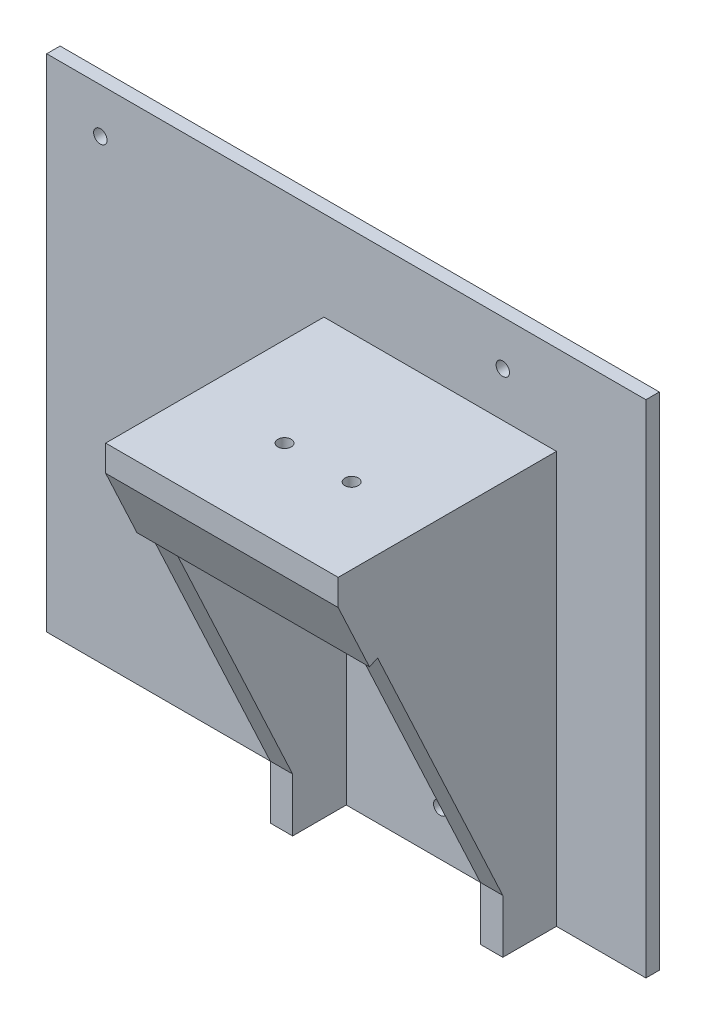
ISO-10303-21;
HEADER;
FILE_DESCRIPTION(('STEP AP214'),'2;1');
FILE_NAME('part.step','',(''),(''),'','','');
FILE_SCHEMA(('AUTOMOTIVE_DESIGN { 1 0 10303 214 1 1 1 1 }'));
ENDSEC;
DATA;
#1=APPLICATION_CONTEXT('core data for automotive mechanical design processes');
#2=APPLICATION_PROTOCOL_DEFINITION('international standard','automotive_design',2000,#1);
#3=PRODUCT_CONTEXT('',#1,'mechanical');
#4=PRODUCT('Part','Part','',(#3));
#5=PRODUCT_RELATED_PRODUCT_CATEGORY('part','',(#4));
#6=PRODUCT_DEFINITION_FORMATION('','',#4);
#7=PRODUCT_DEFINITION_CONTEXT('part definition',#1,'design');
#8=PRODUCT_DEFINITION('design','',#6,#7);
#9=PRODUCT_DEFINITION_SHAPE('','',#8);
#10=(LENGTH_UNIT() NAMED_UNIT(*) SI_UNIT(.MILLI.,.METRE.));
#11=(NAMED_UNIT(*) PLANE_ANGLE_UNIT() SI_UNIT($,.RADIAN.));
#12=(NAMED_UNIT(*) SI_UNIT($,.STERADIAN.) SOLID_ANGLE_UNIT());
#13=UNCERTAINTY_MEASURE_WITH_UNIT(LENGTH_MEASURE(1.E-05),#10,'distance_accuracy_value','');
#14=(GEOMETRIC_REPRESENTATION_CONTEXT(3) GLOBAL_UNCERTAINTY_ASSIGNED_CONTEXT((#13)) GLOBAL_UNIT_ASSIGNED_CONTEXT((#10,
#11,#12)) REPRESENTATION_CONTEXT('',''));
#15=CARTESIAN_POINT('',(0.,0.,0.));
#16=DIRECTION('',(0.,0.,1.));
#17=DIRECTION('',(1.,0.,0.));
#18=AXIS2_PLACEMENT_3D('',#15,#16,#17);
#19=CARTESIAN_POINT('',(36.,-46.,3.));
#20=DIRECTION('',(-1.,0.,0.));
#21=DIRECTION('',(0.,-1.,0.));
#22=AXIS2_PLACEMENT_3D('',#19,#20,#21);
#23=PLANE('',#22);
#24=DIRECTION('',(0.,-1.,0.));
#25=VECTOR('',#24,1.);
#26=CARTESIAN_POINT('',(36.,-46.,3.));
#27=LINE('',#26,#25);
#28=CARTESIAN_POINT('',(36.,46.,3.));
#29=VERTEX_POINT('',#28);
#30=CARTESIAN_POINT('',(36.,-46.,3.));
#31=VERTEX_POINT('',#30);
#32=EDGE_CURVE('E11',#29,#31,#27,.T.);
#33=ORIENTED_EDGE('',*,*,#32,.F.);
#34=DIRECTION('',(0.,0.,-1.));
#35=VECTOR('',#34,1.);
#36=CARTESIAN_POINT('',(36.,46.,3.));
#37=LINE('',#36,#35);
#38=CARTESIAN_POINT('',(36.,46.,51.8123662799905));
#39=VERTEX_POINT('',#38);
#40=EDGE_CURVE('E319',#39,#29,#37,.T.);
#41=ORIENTED_EDGE('',*,*,#40,.F.);
#42=DIRECTION('',(0.,1.,0.));
#43=VECTOR('',#42,1.);
#44=CARTESIAN_POINT('',(36.,0.,51.8123662799905));
#45=LINE('',#44,#43);
#46=CARTESIAN_POINT('',(36.,40.1542290693378,51.8123662799905));
#47=VERTEX_POINT('',#46);
#48=EDGE_CURVE('E243',#47,#39,#45,.T.);
#49=ORIENTED_EDGE('',*,*,#48,.F.);
#50=DIRECTION('',(0.,0.906183139995265,0.422885465331124));
#51=VECTOR('',#50,1.);
#52=CARTESIAN_POINT('',(36.,40.1542290693378,51.8123662799905));
#53=LINE('',#52,#51);
#54=CARTESIAN_POINT('',(36.,25.1542290693377,44.8123662799905));
#55=VERTEX_POINT('',#54);
#56=EDGE_CURVE('E254',#55,#47,#53,.T.);
#57=ORIENTED_EDGE('',*,*,#56,.F.);
#58=DIRECTION('',(0.,0.422885465331124,-0.906183139995265));
#59=VECTOR('',#58,1.);
#60=CARTESIAN_POINT('',(36.,25.1542290693377,44.8123662799905));
#61=LINE('',#60,#59);
#62=CARTESIAN_POINT('',(36.,26.,43.));
#63=VERTEX_POINT('',#62);
#64=EDGE_CURVE('E260',#55,#63,#61,.T.);
#65=ORIENTED_EDGE('',*,*,#64,.T.);
#66=DIRECTION('',(0.,0.906183139995265,0.422885465331124));
#67=VECTOR('',#66,1.);
#68=CARTESIAN_POINT('',(36.,-11.8284671532847,25.3467153284672));
#69=LINE('',#68,#67);
#70=CARTESIAN_POINT('',(36.,-34.,15.));
#71=VERTEX_POINT('',#70);
#72=EDGE_CURVE('E59',#71,#63,#69,.T.);
#73=ORIENTED_EDGE('',*,*,#72,.F.);
#74=DIRECTION('',(0.,1.,0.));
#75=VECTOR('',#74,1.);
#76=CARTESIAN_POINT('',(36.,0.,15.));
#77=LINE('',#76,#75);
#78=CARTESIAN_POINT('',(36.,-46.,15.));
#79=VERTEX_POINT('',#78);
#80=EDGE_CURVE('E293',#79,#71,#77,.T.);
#81=ORIENTED_EDGE('',*,*,#80,.F.);
#82=DIRECTION('',(0.,0.,-1.));
#83=VECTOR('',#82,1.);
#84=CARTESIAN_POINT('',(36.,-46.,3.));
#85=LINE('',#84,#83);
#86=EDGE_CURVE('E316',#79,#31,#85,.T.);
#87=ORIENTED_EDGE('',*,*,#86,.T.);
#88=EDGE_LOOP('',(#33,#41,#49,#57,#65,#73,#81,#87));
#89=FACE_BOUND('',#88,.T.);
#90=ADVANCED_FACE('F35',(#89),#23,.F.);
#91=CARTESIAN_POINT('',(-36.,46.,3.));
#92=DIRECTION('',(0.,-1.,0.));
#93=DIRECTION('',(0.,0.,-1.));
#94=AXIS2_PLACEMENT_3D('',#91,#92,#93);
#95=PLANE('',#94);
#96=CARTESIAN_POINT('',(19.,46.,31.8123662799905));
#97=DIRECTION('',(0.,1.,0.));
#98=DIRECTION('',(0.,0.,1.));
#99=AXIS2_PLACEMENT_3D('',#96,#97,#98);
#100=CIRCLE('',#99,1.5);
#101=CARTESIAN_POINT('',(19.,46.,33.3123662799905));
#102=VERTEX_POINT('',#101);
#103=EDGE_CURVE('E221',#102,#102,#100,.T.);
#104=ORIENTED_EDGE('',*,*,#103,.F.);
#105=EDGE_LOOP('',(#104));
#106=FACE_BOUND('',#105,.T.);
#107=CARTESIAN_POINT('',(3.99999999999998,46.,31.8123662799905));
#108=DIRECTION('',(0.,1.,0.));
#109=DIRECTION('',(0.,0.,1.));
#110=AXIS2_PLACEMENT_3D('',#107,#108,#109);
#111=CIRCLE('',#110,1.5);
#112=CARTESIAN_POINT('',(3.99999999999998,46.,33.3123662799905));
#113=VERTEX_POINT('',#112);
#114=EDGE_CURVE('E214',#113,#113,#111,.T.);
#115=ORIENTED_EDGE('',*,*,#114,.F.);
#116=EDGE_LOOP('',(#115));
#117=FACE_BOUND('',#116,.T.);
#118=DIRECTION('',(1.,0.,0.));
#119=VECTOR('',#118,1.);
#120=CARTESIAN_POINT('',(36.,46.,3.));
#121=LINE('',#120,#119);
#122=CARTESIAN_POINT('',(-16.,46.,3.));
#123=VERTEX_POINT('',#122);
#124=EDGE_CURVE('E43',#123,#29,#121,.T.);
#125=ORIENTED_EDGE('',*,*,#124,.F.);
#126=DIRECTION('',(0.,0.,-1.));
#127=VECTOR('',#126,1.);
#128=CARTESIAN_POINT('',(-16.,46.,50.));
#129=LINE('',#128,#127);
#130=CARTESIAN_POINT('',(-16.,46.,51.8123662799905));
#131=VERTEX_POINT('',#130);
#132=EDGE_CURVE('E305',#131,#123,#129,.T.);
#133=ORIENTED_EDGE('',*,*,#132,.F.);
#134=DIRECTION('',(-1.,0.,0.));
#135=VECTOR('',#134,1.);
#136=CARTESIAN_POINT('',(0.,46.,51.8123662799905));
#137=LINE('',#136,#135);
#138=EDGE_CURVE('E246',#39,#131,#137,.T.);
#139=ORIENTED_EDGE('',*,*,#138,.F.);
#140=ORIENTED_EDGE('',*,*,#40,.T.);
#141=EDGE_LOOP('',(#125,#133,#139,#140));
#142=FACE_BOUND('',#141,.T.);
#143=ADVANCED_FACE('F373',(#106,#117,#142),#95,.F.);
#144=CARTESIAN_POINT('',(36.001,-11.8284671532847,25.3467153284672));
#145=DIRECTION('',(0.,0.422885465331124,-0.906183139995265));
#146=DIRECTION('',(0.,0.906183139995265,0.422885465331124));
#147=AXIS2_PLACEMENT_3D('',#144,#145,#146);
#148=PLANE('',#147);
#149=DIRECTION('',(1.,0.,0.));
#150=VECTOR('',#149,1.);
#151=CARTESIAN_POINT('',(-16.,26.,43.));
#152=LINE('',#151,#150);
#153=CARTESIAN_POINT('',(-16.,26.,43.));
#154=VERTEX_POINT('',#153);
#155=CARTESIAN_POINT('',(-11.,26.,43.));
#156=VERTEX_POINT('',#155);
#157=EDGE_CURVE('E51',#154,#156,#152,.T.);
#158=ORIENTED_EDGE('',*,*,#157,.F.);
#159=DIRECTION('',(0.,-0.906183139995265,-0.422885465331124));
#160=VECTOR('',#159,1.);
#161=CARTESIAN_POINT('',(-16.,-11.8284671532847,25.3467153284672));
#162=LINE('',#161,#160);
#163=CARTESIAN_POINT('',(-16.,-34.,15.));
#164=VERTEX_POINT('',#163);
#165=EDGE_CURVE('E276',#154,#164,#162,.T.);
#166=ORIENTED_EDGE('',*,*,#165,.T.);
#167=DIRECTION('',(-1.,0.,0.));
#168=VECTOR('',#167,1.);
#169=CARTESIAN_POINT('',(36.001,-34.,15.));
#170=LINE('',#169,#168);
#171=CARTESIAN_POINT('',(-11.,-34.,15.));
#172=VERTEX_POINT('',#171);
#173=EDGE_CURVE('E280',#172,#164,#170,.T.);
#174=ORIENTED_EDGE('',*,*,#173,.F.);
#175=DIRECTION('',(0.,0.906183139995265,0.422885465331124));
#176=VECTOR('',#175,1.);
#177=CARTESIAN_POINT('',(-11.,-11.8284671532847,25.3467153284672));
#178=LINE('',#177,#176);
#179=EDGE_CURVE('E267',#172,#156,#178,.T.);
#180=ORIENTED_EDGE('',*,*,#179,.T.);
#181=EDGE_LOOP('',(#158,#166,#174,#180));
#182=FACE_BOUND('',#181,.T.);
#183=ADVANCED_FACE('F341',(#182),#148,.F.);
#184=DIRECTION('',(1.,0.,0.));
#185=VECTOR('',#184,1.);
#186=CARTESIAN_POINT('',(36.001,26.,43.));
#187=LINE('',#186,#185);
#188=CARTESIAN_POINT('',(31.,26.,43.));
#189=VERTEX_POINT('',#188);
#190=EDGE_CURVE('E38',#189,#63,#187,.T.);
#191=ORIENTED_EDGE('',*,*,#190,.F.);
#192=DIRECTION('',(0.,-0.906183139995265,-0.422885465331124));
#193=VECTOR('',#192,1.);
#194=CARTESIAN_POINT('',(31.,-11.8284671532847,25.3467153284672));
#195=LINE('',#194,#193);
#196=CARTESIAN_POINT('',(31.,-34.,15.));
#197=VERTEX_POINT('',#196);
#198=EDGE_CURVE('E269',#189,#197,#195,.T.);
#199=ORIENTED_EDGE('',*,*,#198,.T.);
#200=EDGE_CURVE('E285',#71,#197,#170,.T.);
#201=ORIENTED_EDGE('',*,*,#200,.F.);
#202=ORIENTED_EDGE('',*,*,#72,.T.);
#203=EDGE_LOOP('',(#191,#199,#201,#202));
#204=FACE_BOUND('',#203,.T.);
#205=ADVANCED_FACE('F358',(#204),#148,.F.);
#206=CARTESIAN_POINT('',(0.,0.,3.));
#207=DIRECTION('',(0.,0.,-1.));
#208=DIRECTION('',(-1.,0.,0.));
#209=AXIS2_PLACEMENT_3D('',#206,#207,#208);
#210=PLANE('',#209);
#211=CARTESIAN_POINT('',(9.99999999999998,-36.,3.));
#212=DIRECTION('',(0.,0.,1.));
#213=DIRECTION('',(1.,0.,0.));
#214=AXIS2_PLACEMENT_3D('',#211,#212,#213);
#215=CIRCLE('',#214,1.5);
#216=CARTESIAN_POINT('',(11.5,-36.,3.));
#217=VERTEX_POINT('',#216);
#218=EDGE_CURVE('E425',#217,#217,#215,.T.);
#219=ORIENTED_EDGE('',*,*,#218,.F.);
#220=EDGE_LOOP('',(#219));
#221=FACE_BOUND('',#220,.T.);
#222=DIRECTION('',(0.,-1.,0.));
#223=VECTOR('',#222,1.);
#224=CARTESIAN_POINT('',(31.,-46.,3.));
#225=LINE('',#224,#223);
#226=CARTESIAN_POINT('',(31.,43.,3.));
#227=VERTEX_POINT('',#226);
#228=CARTESIAN_POINT('',(31.,-46.,3.));
#229=VERTEX_POINT('',#228);
#230=EDGE_CURVE('E308',#227,#229,#225,.T.);
#231=ORIENTED_EDGE('',*,*,#230,.F.);
#232=DIRECTION('',(1.,0.,0.));
#233=VECTOR('',#232,1.);
#234=CARTESIAN_POINT('',(-11.,43.,3.));
#235=LINE('',#234,#233);
#236=CARTESIAN_POINT('',(-11.,43.,3.));
#237=VERTEX_POINT('',#236);
#238=EDGE_CURVE('E234',#237,#227,#235,.T.);
#239=ORIENTED_EDGE('',*,*,#238,.F.);
#240=DIRECTION('',(0.,1.,0.));
#241=VECTOR('',#240,1.);
#242=CARTESIAN_POINT('',(-11.,-46.,3.));
#243=LINE('',#242,#241);
#244=CARTESIAN_POINT('',(-11.,-46.,3.));
#245=VERTEX_POINT('',#244);
#246=EDGE_CURVE('E296',#245,#237,#243,.T.);
#247=ORIENTED_EDGE('',*,*,#246,.F.);
#248=DIRECTION('',(1.,0.,0.));
#249=VECTOR('',#248,1.);
#250=CARTESIAN_POINT('',(-36.,-46.,3.));
#251=LINE('',#250,#249);
#252=EDGE_CURVE('E317',#245,#229,#251,.T.);
#253=ORIENTED_EDGE('',*,*,#252,.T.);
#254=EDGE_LOOP('',(#231,#239,#247,#253));
#255=FACE_BOUND('',#254,.T.);
#256=ADVANCED_FACE('F381',(#221,#255),#210,.F.);
#257=CARTESIAN_POINT('',(24.,56.,3.));
#258=DIRECTION('',(0.,0.,1.));
#259=DIRECTION('',(1.,0.,0.));
#260=AXIS2_PLACEMENT_3D('',#257,#258,#259);
#261=CIRCLE('',#260,1.5);
#262=CARTESIAN_POINT('',(25.5,56.,3.));
#263=VERTEX_POINT('',#262);
#264=EDGE_CURVE('E189',#263,#263,#261,.T.);
#265=ORIENTED_EDGE('',*,*,#264,.F.);
#266=EDGE_LOOP('',(#265));
#267=FACE_BOUND('',#266,.T.);
#268=CARTESIAN_POINT('',(-66.,56.,3.));
#269=DIRECTION('',(0.,0.,1.));
#270=DIRECTION('',(1.,0.,0.));
#271=AXIS2_PLACEMENT_3D('',#268,#269,#270);
#272=CIRCLE('',#271,1.5);
#273=CARTESIAN_POINT('',(-64.5,56.,3.));
#274=VERTEX_POINT('',#273);
#275=EDGE_CURVE('E421',#274,#274,#272,.T.);
#276=ORIENTED_EDGE('',*,*,#275,.F.);
#277=EDGE_LOOP('',(#276));
#278=FACE_BOUND('',#277,.T.);
#279=DIRECTION('',(0.,-1.,0.));
#280=VECTOR('',#279,1.);
#281=CARTESIAN_POINT('',(-16.,-46.,3.));
#282=LINE('',#281,#280);
#283=CARTESIAN_POINT('',(-16.,-46.,3.));
#284=VERTEX_POINT('',#283);
#285=EDGE_CURVE('E298',#123,#284,#282,.T.);
#286=ORIENTED_EDGE('',*,*,#285,.F.);
#287=ORIENTED_EDGE('',*,*,#124,.T.);
#288=ORIENTED_EDGE('',*,*,#32,.T.);
#289=DIRECTION('',(-1.,0.,0.));
#290=VECTOR('',#289,1.);
#291=CARTESIAN_POINT('',(56.,-46.,3.));
#292=LINE('',#291,#290);
#293=CARTESIAN_POINT('',(56.,-46.,3.));
#294=VERTEX_POINT('',#293);
#295=EDGE_CURVE('E174',#294,#31,#292,.T.);
#296=ORIENTED_EDGE('',*,*,#295,.F.);
#297=DIRECTION('',(0.,-1.,0.));
#298=VECTOR('',#297,1.);
#299=CARTESIAN_POINT('',(56.,-46.,3.));
#300=LINE('',#299,#298);
#301=CARTESIAN_POINT('',(56.,66.,3.));
#302=VERTEX_POINT('',#301);
#303=EDGE_CURVE('E203',#302,#294,#300,.T.);
#304=ORIENTED_EDGE('',*,*,#303,.F.);
#305=DIRECTION('',(1.,0.,0.));
#306=VECTOR('',#305,1.);
#307=CARTESIAN_POINT('',(36.,66.,3.));
#308=LINE('',#307,#306);
#309=CARTESIAN_POINT('',(-78.,66.,3.));
#310=VERTEX_POINT('',#309);
#311=EDGE_CURVE('E173',#310,#302,#308,.T.);
#312=ORIENTED_EDGE('',*,*,#311,.F.);
#313=DIRECTION('',(0.,1.,0.));
#314=VECTOR('',#313,1.);
#315=CARTESIAN_POINT('',(-78.,-46.,3.));
#316=LINE('',#315,#314);
#317=CARTESIAN_POINT('',(-78.,-46.,3.));
#318=VERTEX_POINT('',#317);
#319=EDGE_CURVE('E188',#318,#310,#316,.T.);
#320=ORIENTED_EDGE('',*,*,#319,.F.);
#321=EDGE_CURVE('E313',#318,#284,#251,.T.);
#322=ORIENTED_EDGE('',*,*,#321,.T.);
#323=EDGE_LOOP('',(#286,#287,#288,#296,#304,#312,#320,#322));
#324=FACE_BOUND('',#323,.T.);
#325=ADVANCED_FACE('F370',(#267,#278,#324),#210,.F.);
#326=CARTESIAN_POINT('',(-36.,-46.,3.));
#327=DIRECTION('',(0.,1.,0.));
#328=DIRECTION('',(0.,0.,1.));
#329=AXIS2_PLACEMENT_3D('',#326,#327,#328);
#330=PLANE('',#329);
#331=ORIENTED_EDGE('',*,*,#86,.F.);
#332=DIRECTION('',(-1.,0.,0.));
#333=VECTOR('',#332,1.);
#334=CARTESIAN_POINT('',(36.001,-46.,15.));
#335=LINE('',#334,#333);
#336=CARTESIAN_POINT('',(31.,-46.,15.));
#337=VERTEX_POINT('',#336);
#338=EDGE_CURVE('E284',#79,#337,#335,.T.);
#339=ORIENTED_EDGE('',*,*,#338,.T.);
#340=DIRECTION('',(0.,0.,-1.));
#341=VECTOR('',#340,1.);
#342=CARTESIAN_POINT('',(31.,-46.,50.));
#343=LINE('',#342,#341);
#344=EDGE_CURVE('E311',#337,#229,#343,.T.);
#345=ORIENTED_EDGE('',*,*,#344,.T.);
#346=ORIENTED_EDGE('',*,*,#252,.F.);
#347=DIRECTION('',(0.,0.,-1.));
#348=VECTOR('',#347,1.);
#349=CARTESIAN_POINT('',(-11.,-46.,50.));
#350=LINE('',#349,#348);
#351=CARTESIAN_POINT('',(-11.,-46.,15.));
#352=VERTEX_POINT('',#351);
#353=EDGE_CURVE('E301',#352,#245,#350,.T.);
#354=ORIENTED_EDGE('',*,*,#353,.F.);
#355=CARTESIAN_POINT('',(-16.,-46.,15.));
#356=VERTEX_POINT('',#355);
#357=EDGE_CURVE('E281',#352,#356,#335,.T.);
#358=ORIENTED_EDGE('',*,*,#357,.T.);
#359=DIRECTION('',(0.,0.,-1.));
#360=VECTOR('',#359,1.);
#361=CARTESIAN_POINT('',(-16.,-46.,50.));
#362=LINE('',#361,#360);
#363=EDGE_CURVE('E303',#356,#284,#362,.T.);
#364=ORIENTED_EDGE('',*,*,#363,.T.);
#365=ORIENTED_EDGE('',*,*,#321,.F.);
#366=DIRECTION('',(0.,0.,1.));
#367=VECTOR('',#366,1.);
#368=CARTESIAN_POINT('',(-78.,-46.,0.));
#369=LINE('',#368,#367);
#370=CARTESIAN_POINT('',(-78.,-46.,0.));
#371=VERTEX_POINT('',#370);
#372=EDGE_CURVE('E183',#371,#318,#369,.T.);
#373=ORIENTED_EDGE('',*,*,#372,.F.);
#374=DIRECTION('',(1.,0.,0.));
#375=VECTOR('',#374,1.);
#376=CARTESIAN_POINT('',(-36.,-46.,0.));
#377=LINE('',#376,#375);
#378=CARTESIAN_POINT('',(56.,-46.,0.));
#379=VERTEX_POINT('',#378);
#380=EDGE_CURVE('E179',#371,#379,#377,.T.);
#381=ORIENTED_EDGE('',*,*,#380,.T.);
#382=DIRECTION('',(0.,0.,-1.));
#383=VECTOR('',#382,1.);
#384=CARTESIAN_POINT('',(56.,-46.,0.));
#385=LINE('',#384,#383);
#386=EDGE_CURVE('E205',#294,#379,#385,.T.);
#387=ORIENTED_EDGE('',*,*,#386,.F.);
#388=ORIENTED_EDGE('',*,*,#295,.T.);
#389=EDGE_LOOP('',(#331,#339,#345,#346,#354,#358,#364,#365,#373,#381,#387,#388));
#390=FACE_BOUND('',#389,.T.);
#391=ADVANCED_FACE('F364',(#390),#330,.F.);
#392=CARTESIAN_POINT('',(0.,0.,0.));
#393=DIRECTION('',(0.,0.,-1.));
#394=DIRECTION('',(-1.,0.,0.));
#395=AXIS2_PLACEMENT_3D('',#392,#393,#394);
#396=PLANE('',#395);
#397=CARTESIAN_POINT('',(24.,56.,0.));
#398=DIRECTION('',(0.,0.,-1.));
#399=DIRECTION('',(-1.,0.,0.));
#400=AXIS2_PLACEMENT_3D('',#397,#398,#399);
#401=CIRCLE('',#400,1.5);
#402=CARTESIAN_POINT('',(25.5,56.,0.));
#403=VERTEX_POINT('',#402);
#404=EDGE_CURVE('E192',#403,#403,#401,.F.);
#405=ORIENTED_EDGE('',*,*,#404,.T.);
#406=EDGE_LOOP('',(#405));
#407=FACE_BOUND('',#406,.T.);
#408=CARTESIAN_POINT('',(9.99999999999998,-36.,0.));
#409=DIRECTION('',(0.,0.,-1.));
#410=DIRECTION('',(-1.,0.,0.));
#411=AXIS2_PLACEMENT_3D('',#408,#409,#410);
#412=CIRCLE('',#411,1.5);
#413=CARTESIAN_POINT('',(11.5,-36.,0.));
#414=VERTEX_POINT('',#413);
#415=EDGE_CURVE('E417',#414,#414,#412,.F.);
#416=ORIENTED_EDGE('',*,*,#415,.T.);
#417=EDGE_LOOP('',(#416));
#418=FACE_BOUND('',#417,.T.);
#419=CARTESIAN_POINT('',(-66.,56.,0.));
#420=DIRECTION('',(0.,0.,-1.));
#421=DIRECTION('',(-1.,0.,0.));
#422=AXIS2_PLACEMENT_3D('',#419,#420,#421);
#423=CIRCLE('',#422,1.5);
#424=CARTESIAN_POINT('',(-64.5,56.,0.));
#425=VERTEX_POINT('',#424);
#426=EDGE_CURVE('E195',#425,#425,#423,.F.);
#427=ORIENTED_EDGE('',*,*,#426,.T.);
#428=EDGE_LOOP('',(#427));
#429=FACE_BOUND('',#428,.T.);
#430=DIRECTION('',(-1.,0.,0.));
#431=VECTOR('',#430,1.);
#432=CARTESIAN_POINT('',(36.,66.,0.));
#433=LINE('',#432,#431);
#434=CARTESIAN_POINT('',(56.,66.,0.));
#435=VERTEX_POINT('',#434);
#436=CARTESIAN_POINT('',(-78.,66.,0.));
#437=VERTEX_POINT('',#436);
#438=EDGE_CURVE('E163',#435,#437,#433,.T.);
#439=ORIENTED_EDGE('',*,*,#438,.F.);
#440=DIRECTION('',(0.,1.,0.));
#441=VECTOR('',#440,1.);
#442=CARTESIAN_POINT('',(56.,-46.,0.));
#443=LINE('',#442,#441);
#444=EDGE_CURVE('E200',#379,#435,#443,.T.);
#445=ORIENTED_EDGE('',*,*,#444,.F.);
#446=ORIENTED_EDGE('',*,*,#380,.F.);
#447=DIRECTION('',(0.,-1.,0.));
#448=VECTOR('',#447,1.);
#449=CARTESIAN_POINT('',(-78.,66.,0.));
#450=LINE('',#449,#448);
#451=EDGE_CURVE('E177',#437,#371,#450,.T.);
#452=ORIENTED_EDGE('',*,*,#451,.F.);
#453=EDGE_LOOP('',(#439,#445,#446,#452));
#454=FACE_BOUND('',#453,.T.);
#455=ADVANCED_FACE('F178',(#407,#418,#429,#454),#396,.T.);
#456=CARTESIAN_POINT('',(31.,-46.,50.));
#457=DIRECTION('',(1.,0.,0.));
#458=DIRECTION('',(0.,0.,-1.));
#459=AXIS2_PLACEMENT_3D('',#456,#457,#458);
#460=PLANE('',#459);
#461=DIRECTION('',(0.,-1.,0.));
#462=VECTOR('',#461,1.);
#463=CARTESIAN_POINT('',(31.,0.,15.));
#464=LINE('',#463,#462);
#465=EDGE_CURVE('E291',#197,#337,#464,.T.);
#466=ORIENTED_EDGE('',*,*,#465,.F.);
#467=ORIENTED_EDGE('',*,*,#198,.F.);
#468=DIRECTION('',(0.,-1.,0.));
#469=VECTOR('',#468,1.);
#470=CARTESIAN_POINT('',(31.,43.,43.));
#471=LINE('',#470,#469);
#472=CARTESIAN_POINT('',(31.,43.,43.));
#473=VERTEX_POINT('',#472);
#474=EDGE_CURVE('E237',#473,#189,#471,.T.);
#475=ORIENTED_EDGE('',*,*,#474,.F.);
#476=DIRECTION('',(0.,0.,1.));
#477=VECTOR('',#476,1.);
#478=CARTESIAN_POINT('',(31.,43.,3.));
#479=LINE('',#478,#477);
#480=EDGE_CURVE('E217',#227,#473,#479,.T.);
#481=ORIENTED_EDGE('',*,*,#480,.F.);
#482=ORIENTED_EDGE('',*,*,#230,.T.);
#483=ORIENTED_EDGE('',*,*,#344,.F.);
#484=EDGE_LOOP('',(#466,#467,#475,#481,#482,#483));
#485=FACE_BOUND('',#484,.T.);
#486=ADVANCED_FACE('F356',(#485),#460,.F.);
#487=CARTESIAN_POINT('',(-11.,-46.,50.));
#488=DIRECTION('',(-1.,0.,0.));
#489=DIRECTION('',(0.,0.,1.));
#490=AXIS2_PLACEMENT_3D('',#487,#488,#489);
#491=PLANE('',#490);
#492=ORIENTED_EDGE('',*,*,#246,.T.);
#493=DIRECTION('',(0.,0.,-1.));
#494=VECTOR('',#493,1.);
#495=CARTESIAN_POINT('',(-11.,43.,43.));
#496=LINE('',#495,#494);
#497=CARTESIAN_POINT('',(-11.,43.,43.));
#498=VERTEX_POINT('',#497);
#499=EDGE_CURVE('E231',#498,#237,#496,.T.);
#500=ORIENTED_EDGE('',*,*,#499,.F.);
#501=DIRECTION('',(0.,-1.,0.));
#502=VECTOR('',#501,1.);
#503=CARTESIAN_POINT('',(-11.,43.,43.));
#504=LINE('',#503,#502);
#505=EDGE_CURVE('E238',#498,#156,#504,.T.);
#506=ORIENTED_EDGE('',*,*,#505,.T.);
#507=ORIENTED_EDGE('',*,*,#179,.F.);
#508=DIRECTION('',(0.,1.,0.));
#509=VECTOR('',#508,1.);
#510=CARTESIAN_POINT('',(-11.,0.,15.));
#511=LINE('',#510,#509);
#512=EDGE_CURVE('E288',#352,#172,#511,.T.);
#513=ORIENTED_EDGE('',*,*,#512,.F.);
#514=ORIENTED_EDGE('',*,*,#353,.T.);
#515=EDGE_LOOP('',(#492,#500,#506,#507,#513,#514));
#516=FACE_BOUND('',#515,.T.);
#517=ADVANCED_FACE('F348',(#516),#491,.F.);
#518=CARTESIAN_POINT('',(-16.,-46.,50.));
#519=DIRECTION('',(1.,0.,0.));
#520=DIRECTION('',(0.,1.,0.));
#521=AXIS2_PLACEMENT_3D('',#518,#519,#520);
#522=PLANE('',#521);
#523=DIRECTION('',(0.,-0.906183139995265,-0.422885465331124));
#524=VECTOR('',#523,1.);
#525=CARTESIAN_POINT('',(-16.,40.1542290693378,51.8123662799905));
#526=LINE('',#525,#524);
#527=CARTESIAN_POINT('',(-16.,40.1542290693378,51.8123662799905));
#528=VERTEX_POINT('',#527);
#529=CARTESIAN_POINT('',(-16.,25.1542290693377,44.8123662799905));
#530=VERTEX_POINT('',#529);
#531=EDGE_CURVE('E249',#528,#530,#526,.T.);
#532=ORIENTED_EDGE('',*,*,#531,.F.);
#533=DIRECTION('',(0.,-1.,0.));
#534=VECTOR('',#533,1.);
#535=CARTESIAN_POINT('',(-16.,0.,51.8123662799905));
#536=LINE('',#535,#534);
#537=EDGE_CURVE('E240',#131,#528,#536,.T.);
#538=ORIENTED_EDGE('',*,*,#537,.F.);
#539=ORIENTED_EDGE('',*,*,#132,.T.);
#540=ORIENTED_EDGE('',*,*,#285,.T.);
#541=ORIENTED_EDGE('',*,*,#363,.F.);
#542=DIRECTION('',(0.,-1.,0.));
#543=VECTOR('',#542,1.);
#544=CARTESIAN_POINT('',(-16.,0.,15.));
#545=LINE('',#544,#543);
#546=EDGE_CURVE('E278',#164,#356,#545,.T.);
#547=ORIENTED_EDGE('',*,*,#546,.F.);
#548=ORIENTED_EDGE('',*,*,#165,.F.);
#549=DIRECTION('',(0.,0.422885465331124,-0.906183139995265));
#550=VECTOR('',#549,1.);
#551=CARTESIAN_POINT('',(-16.,25.1542290693377,44.8123662799905));
#552=LINE('',#551,#550);
#553=EDGE_CURVE('E264',#530,#154,#552,.T.);
#554=ORIENTED_EDGE('',*,*,#553,.F.);
#555=EDGE_LOOP('',(#532,#538,#539,#540,#541,#547,#548,#554));
#556=FACE_BOUND('',#555,.T.);
#557=ADVANCED_FACE('F337',(#556),#522,.F.);
#558=CARTESIAN_POINT('',(36.001,0.,15.));
#559=DIRECTION('',(0.,0.,-1.));
#560=DIRECTION('',(-1.,0.,0.));
#561=AXIS2_PLACEMENT_3D('',#558,#559,#560);
#562=PLANE('',#561);
#563=ORIENTED_EDGE('',*,*,#80,.T.);
#564=ORIENTED_EDGE('',*,*,#200,.T.);
#565=ORIENTED_EDGE('',*,*,#465,.T.);
#566=ORIENTED_EDGE('',*,*,#338,.F.);
#567=EDGE_LOOP('',(#563,#564,#565,#566));
#568=FACE_BOUND('',#567,.T.);
#569=ADVANCED_FACE('F360',(#568),#562,.F.);
#570=ORIENTED_EDGE('',*,*,#512,.T.);
#571=ORIENTED_EDGE('',*,*,#173,.T.);
#572=ORIENTED_EDGE('',*,*,#546,.T.);
#573=ORIENTED_EDGE('',*,*,#357,.F.);
#574=EDGE_LOOP('',(#570,#571,#572,#573));
#575=FACE_BOUND('',#574,.T.);
#576=ADVANCED_FACE('F343',(#575),#562,.F.);
#577=CARTESIAN_POINT('',(-16.,25.1542290693377,44.8123662799905));
#578=DIRECTION('',(0.,0.906183139995265,0.422885465331124));
#579=DIRECTION('',(0.,-0.422885465331124,0.906183139995265));
#580=AXIS2_PLACEMENT_3D('',#577,#578,#579);
#581=PLANE('',#580);
#582=ORIENTED_EDGE('',*,*,#157,.T.);
#583=DIRECTION('',(-1.,0.,0.));
#584=VECTOR('',#583,1.);
#585=CARTESIAN_POINT('',(36.001,26.,43.));
#586=LINE('',#585,#584);
#587=EDGE_CURVE('E273',#189,#156,#586,.T.);
#588=ORIENTED_EDGE('',*,*,#587,.F.);
#589=ORIENTED_EDGE('',*,*,#190,.T.);
#590=ORIENTED_EDGE('',*,*,#64,.F.);
#591=DIRECTION('',(1.,0.,0.));
#592=VECTOR('',#591,1.);
#593=CARTESIAN_POINT('',(-16.,25.1542290693377,44.8123662799905));
#594=LINE('',#593,#592);
#595=EDGE_CURVE('E252',#530,#55,#594,.T.);
#596=ORIENTED_EDGE('',*,*,#595,.F.);
#597=ORIENTED_EDGE('',*,*,#553,.T.);
#598=EDGE_LOOP('',(#582,#588,#589,#590,#596,#597));
#599=FACE_BOUND('',#598,.T.);
#600=ADVANCED_FACE('F326',(#599),#581,.F.);
#601=CARTESIAN_POINT('',(0.,-12.6742380839469,27.1590816084577));
#602=DIRECTION('',(0.,-0.422885465331124,0.906183139995265));
#603=DIRECTION('',(0.,-0.906183139995265,-0.422885465331124));
#604=AXIS2_PLACEMENT_3D('',#601,#602,#603);
#605=PLANE('',#604);
#606=ORIENTED_EDGE('',*,*,#531,.T.);
#607=ORIENTED_EDGE('',*,*,#595,.T.);
#608=ORIENTED_EDGE('',*,*,#56,.T.);
#609=DIRECTION('',(-1.,0.,0.));
#610=VECTOR('',#609,1.);
#611=CARTESIAN_POINT('',(-16.,40.1542290693378,51.8123662799905));
#612=LINE('',#611,#610);
#613=EDGE_CURVE('E257',#47,#528,#612,.T.);
#614=ORIENTED_EDGE('',*,*,#613,.T.);
#615=EDGE_LOOP('',(#606,#607,#608,#614));
#616=FACE_BOUND('',#615,.T.);
#617=ADVANCED_FACE('F333',(#616),#605,.T.);
#618=CARTESIAN_POINT('',(0.,0.,51.8123662799905));
#619=DIRECTION('',(0.,0.,1.));
#620=DIRECTION('',(1.,0.,0.));
#621=AXIS2_PLACEMENT_3D('',#618,#619,#620);
#622=PLANE('',#621);
#623=ORIENTED_EDGE('',*,*,#537,.T.);
#624=ORIENTED_EDGE('',*,*,#613,.F.);
#625=ORIENTED_EDGE('',*,*,#48,.T.);
#626=ORIENTED_EDGE('',*,*,#138,.T.);
#627=EDGE_LOOP('',(#623,#624,#625,#626));
#628=FACE_BOUND('',#627,.T.);
#629=ADVANCED_FACE('F372',(#628),#622,.T.);
#630=CARTESIAN_POINT('',(31.,43.,43.));
#631=DIRECTION('',(0.,0.,1.));
#632=DIRECTION('',(1.,0.,0.));
#633=AXIS2_PLACEMENT_3D('',#630,#631,#632);
#634=PLANE('',#633);
#635=ORIENTED_EDGE('',*,*,#587,.T.);
#636=ORIENTED_EDGE('',*,*,#505,.F.);
#637=DIRECTION('',(-1.,0.,0.));
#638=VECTOR('',#637,1.);
#639=CARTESIAN_POINT('',(31.,43.,43.));
#640=LINE('',#639,#638);
#641=EDGE_CURVE('E228',#473,#498,#640,.T.);
#642=ORIENTED_EDGE('',*,*,#641,.F.);
#643=ORIENTED_EDGE('',*,*,#474,.T.);
#644=EDGE_LOOP('',(#635,#636,#642,#643));
#645=FACE_BOUND('',#644,.T.);
#646=ADVANCED_FACE('F352',(#645),#634,.F.);
#647=CARTESIAN_POINT('',(0.,43.,0.));
#648=DIRECTION('',(0.,-1.,0.));
#649=DIRECTION('',(1.,0.,0.));
#650=AXIS2_PLACEMENT_3D('',#647,#648,#649);
#651=PLANE('',#650);
#652=CARTESIAN_POINT('',(3.99999999999998,43.,31.8123662799905));
#653=DIRECTION('',(0.,-1.,0.));
#654=DIRECTION('',(1.,0.,0.));
#655=AXIS2_PLACEMENT_3D('',#652,#653,#654);
#656=CIRCLE('',#655,1.5);
#657=CARTESIAN_POINT('',(5.49999999999998,43.,31.8123662799905));
#658=VERTEX_POINT('',#657);
#659=EDGE_CURVE('E218',#658,#658,#656,.F.);
#660=ORIENTED_EDGE('',*,*,#659,.T.);
#661=EDGE_LOOP('',(#660));
#662=FACE_BOUND('',#661,.T.);
#663=CARTESIAN_POINT('',(19.,43.,31.8123662799905));
#664=DIRECTION('',(0.,-1.,0.));
#665=DIRECTION('',(1.,0.,0.));
#666=AXIS2_PLACEMENT_3D('',#663,#664,#665);
#667=CIRCLE('',#666,1.5);
#668=CARTESIAN_POINT('',(20.5,43.,31.8123662799905));
#669=VERTEX_POINT('',#668);
#670=EDGE_CURVE('E211',#669,#669,#667,.F.);
#671=ORIENTED_EDGE('',*,*,#670,.T.);
#672=EDGE_LOOP('',(#671));
#673=FACE_BOUND('',#672,.T.);
#674=ORIENTED_EDGE('',*,*,#480,.T.);
#675=ORIENTED_EDGE('',*,*,#641,.T.);
#676=ORIENTED_EDGE('',*,*,#499,.T.);
#677=ORIENTED_EDGE('',*,*,#238,.T.);
#678=EDGE_LOOP('',(#674,#675,#676,#677));
#679=FACE_BOUND('',#678,.T.);
#680=ADVANCED_FACE('F380',(#662,#673,#679),#651,.T.);
#681=CARTESIAN_POINT('',(19.,-46.001,31.8123662799905));
#682=DIRECTION('',(0.,1.,0.));
#683=DIRECTION('',(0.,0.,1.));
#684=AXIS2_PLACEMENT_3D('',#681,#682,#683);
#685=CYLINDRICAL_SURFACE('',#684,1.5);
#686=ORIENTED_EDGE('',*,*,#670,.F.);
#687=EDGE_LOOP('',(#686));
#688=FACE_BOUND('',#687,.T.);
#689=ORIENTED_EDGE('',*,*,#103,.T.);
#690=EDGE_LOOP('',(#689));
#691=FACE_BOUND('',#690,.T.);
#692=ADVANCED_FACE('F456',(#688,#691),#685,.F.);
#693=CARTESIAN_POINT('',(3.99999999999998,-46.001,31.8123662799905));
#694=DIRECTION('',(0.,1.,0.));
#695=DIRECTION('',(0.,0.,1.));
#696=AXIS2_PLACEMENT_3D('',#693,#694,#695);
#697=CYLINDRICAL_SURFACE('',#696,1.5);
#698=ORIENTED_EDGE('',*,*,#659,.F.);
#699=EDGE_LOOP('',(#698));
#700=FACE_BOUND('',#699,.T.);
#701=ORIENTED_EDGE('',*,*,#114,.T.);
#702=EDGE_LOOP('',(#701));
#703=FACE_BOUND('',#702,.T.);
#704=ADVANCED_FACE('F453',(#700,#703),#697,.F.);
#705=CARTESIAN_POINT('',(0.,66.,0.));
#706=DIRECTION('',(0.,-1.,0.));
#707=DIRECTION('',(0.,0.,-1.));
#708=AXIS2_PLACEMENT_3D('',#705,#706,#707);
#709=PLANE('',#708);
#710=ORIENTED_EDGE('',*,*,#311,.T.);
#711=DIRECTION('',(0.,0.,1.));
#712=VECTOR('',#711,1.);
#713=CARTESIAN_POINT('',(56.,66.,0.));
#714=LINE('',#713,#712);
#715=EDGE_CURVE('E169',#435,#302,#714,.T.);
#716=ORIENTED_EDGE('',*,*,#715,.F.);
#717=ORIENTED_EDGE('',*,*,#438,.T.);
#718=DIRECTION('',(0.,0.,-1.));
#719=VECTOR('',#718,1.);
#720=CARTESIAN_POINT('',(-78.,66.,3.));
#721=LINE('',#720,#719);
#722=EDGE_CURVE('E167',#310,#437,#721,.T.);
#723=ORIENTED_EDGE('',*,*,#722,.F.);
#724=EDGE_LOOP('',(#710,#716,#717,#723));
#725=FACE_BOUND('',#724,.T.);
#726=ADVANCED_FACE('F165',(#725),#709,.F.);
#727=CARTESIAN_POINT('',(56.,0.,0.));
#728=DIRECTION('',(1.,0.,0.));
#729=DIRECTION('',(0.,1.,0.));
#730=AXIS2_PLACEMENT_3D('',#727,#728,#729);
#731=PLANE('',#730);
#732=ORIENTED_EDGE('',*,*,#444,.T.);
#733=ORIENTED_EDGE('',*,*,#715,.T.);
#734=ORIENTED_EDGE('',*,*,#303,.T.);
#735=ORIENTED_EDGE('',*,*,#386,.T.);
#736=EDGE_LOOP('',(#732,#733,#734,#735));
#737=FACE_BOUND('',#736,.T.);
#738=ADVANCED_FACE('F447',(#737),#731,.T.);
#739=CARTESIAN_POINT('',(-78.,0.,0.));
#740=DIRECTION('',(-1.,0.,0.));
#741=DIRECTION('',(0.,-1.,0.));
#742=AXIS2_PLACEMENT_3D('',#739,#740,#741);
#743=PLANE('',#742);
#744=ORIENTED_EDGE('',*,*,#722,.T.);
#745=ORIENTED_EDGE('',*,*,#451,.T.);
#746=ORIENTED_EDGE('',*,*,#372,.T.);
#747=ORIENTED_EDGE('',*,*,#319,.T.);
#748=EDGE_LOOP('',(#744,#745,#746,#747));
#749=FACE_BOUND('',#748,.T.);
#750=ADVANCED_FACE('F186',(#749),#743,.T.);
#751=CARTESIAN_POINT('',(-66.,56.,-0.00100000000000013));
#752=DIRECTION('',(0.,0.,1.));
#753=DIRECTION('',(1.,0.,0.));
#754=AXIS2_PLACEMENT_3D('',#751,#752,#753);
#755=CYLINDRICAL_SURFACE('',#754,1.5);
#756=CARTESIAN_POINT('',(-64.5,56.,0.));
#757=CARTESIAN_POINT('',(-64.5,56.,0.03125));
#758=CARTESIAN_POINT('',(-64.5,56.,0.0625));
#759=CARTESIAN_POINT('',(-64.5,56.,0.125));
#760=CARTESIAN_POINT('',(-64.5,56.,0.15625));
#761=CARTESIAN_POINT('',(-64.5,56.,0.21875));
#762=CARTESIAN_POINT('',(-64.5,56.,0.25));
#763=CARTESIAN_POINT('',(-64.5,56.,0.3125));
#764=CARTESIAN_POINT('',(-64.5,56.,0.34375));
#765=CARTESIAN_POINT('',(-64.5,56.,0.40625));
#766=CARTESIAN_POINT('',(-64.5,56.,0.4375));
#767=CARTESIAN_POINT('',(-64.5,56.,0.5));
#768=CARTESIAN_POINT('',(-64.5,56.,0.53125));
#769=CARTESIAN_POINT('',(-64.5,56.,0.59375));
#770=CARTESIAN_POINT('',(-64.5,56.,0.625));
#771=CARTESIAN_POINT('',(-64.5,56.,0.6875));
#772=CARTESIAN_POINT('',(-64.5,56.,0.71875));
#773=CARTESIAN_POINT('',(-64.5,56.,0.78125));
#774=CARTESIAN_POINT('',(-64.5,56.,0.8125));
#775=CARTESIAN_POINT('',(-64.5,56.,0.875));
#776=CARTESIAN_POINT('',(-64.5,56.,0.90625));
#777=CARTESIAN_POINT('',(-64.5,56.,0.96875));
#778=CARTESIAN_POINT('',(-64.5,56.,1.));
#779=CARTESIAN_POINT('',(-64.5,56.,1.0625));
#780=CARTESIAN_POINT('',(-64.5,56.,1.09375));
#781=CARTESIAN_POINT('',(-64.5,56.,1.15625));
#782=CARTESIAN_POINT('',(-64.5,56.,1.1875));
#783=CARTESIAN_POINT('',(-64.5,56.,1.25));
#784=CARTESIAN_POINT('',(-64.5,56.,1.28125));
#785=CARTESIAN_POINT('',(-64.5,56.,1.34375));
#786=CARTESIAN_POINT('',(-64.5,56.,1.375));
#787=CARTESIAN_POINT('',(-64.5,56.,1.4375));
#788=CARTESIAN_POINT('',(-64.5,56.,1.46875));
#789=CARTESIAN_POINT('',(-64.5,56.,1.53125));
#790=CARTESIAN_POINT('',(-64.5,56.,1.5625));
#791=CARTESIAN_POINT('',(-64.5,56.,1.625));
#792=CARTESIAN_POINT('',(-64.5,56.,1.65625));
#793=CARTESIAN_POINT('',(-64.5,56.,1.71875));
#794=CARTESIAN_POINT('',(-64.5,56.,1.75));
#795=CARTESIAN_POINT('',(-64.5,56.,1.8125));
#796=CARTESIAN_POINT('',(-64.5,56.,1.84375));
#797=CARTESIAN_POINT('',(-64.5,56.,1.90625));
#798=CARTESIAN_POINT('',(-64.5,56.,1.9375));
#799=CARTESIAN_POINT('',(-64.5,56.,2.));
#800=CARTESIAN_POINT('',(-64.5,56.,2.03125));
#801=CARTESIAN_POINT('',(-64.5,56.,2.09375));
#802=CARTESIAN_POINT('',(-64.5,56.,2.125));
#803=CARTESIAN_POINT('',(-64.5,56.,2.1875));
#804=CARTESIAN_POINT('',(-64.5,56.,2.21875));
#805=CARTESIAN_POINT('',(-64.5,56.,2.28125));
#806=CARTESIAN_POINT('',(-64.5,56.,2.3125));
#807=CARTESIAN_POINT('',(-64.5,56.,2.375));
#808=CARTESIAN_POINT('',(-64.5,56.,2.40625));
#809=CARTESIAN_POINT('',(-64.5,56.,2.46875));
#810=CARTESIAN_POINT('',(-64.5,56.,2.5));
#811=CARTESIAN_POINT('',(-64.5,56.,2.5625));
#812=CARTESIAN_POINT('',(-64.5,56.,2.59375));
#813=CARTESIAN_POINT('',(-64.5,56.,2.65625));
#814=CARTESIAN_POINT('',(-64.5,56.,2.6875));
#815=CARTESIAN_POINT('',(-64.5,56.,2.75));
#816=CARTESIAN_POINT('',(-64.5,56.,2.78125));
#817=CARTESIAN_POINT('',(-64.5,56.,2.84375));
#818=CARTESIAN_POINT('',(-64.5,56.,2.875));
#819=CARTESIAN_POINT('',(-64.5,56.,2.9375));
#820=CARTESIAN_POINT('',(-64.5,56.,2.96875));
#821=CARTESIAN_POINT('',(-64.5,56.,3.));
#822=B_SPLINE_CURVE_WITH_KNOTS('',3,(#756,#757,#758,#759,#760,#761,#762,#763,#764,#765,#766,
#767,#768,#769,#770,#771,#772,#773,#774,#775,#776,#777,#778,#779,#780,#781,#782,#783,#784,#785,
#786,#787,#788,#789,#790,#791,#792,#793,#794,#795,#796,#797,#798,#799,#800,#801,#802,#803,#804,
#805,#806,#807,#808,#809,#810,#811,#812,#813,#814,#815,#816,#817,#818,#819,#820,#821),
.UNSPECIFIED.,.F.,.F.,(4,2,2,2,2,2,2,2,2,2,2,2,2,2,2,2,2,2,2,2,2,2,2,2,2,2,2,2,2,2,2,2,4),(0.,
0.09375,0.1875,0.28125,0.375,0.46875,0.5625,0.65625,0.75,0.84375,0.9375,1.03125,1.125,1.21875,
1.3125,1.40625,1.5,1.59375,1.6875,1.78125,1.875,1.96875,2.0625,2.15625,2.25,2.34375,2.4375,
2.53125,2.625,2.71875,2.8125,2.90625,3.),.UNSPECIFIED.);
#823=EDGE_CURVE('BSEAM434',#425,#274,#822,.T.);
#824=ORIENTED_EDGE('',*,*,#426,.F.);
#825=ORIENTED_EDGE('',*,*,#275,.T.);
#826=ORIENTED_EDGE('',*,*,#823,.T.);
#827=ORIENTED_EDGE('',*,*,#823,.F.);
#828=EDGE_LOOP('',(#824,#826,#825,#827));
#829=FACE_BOUND('',#828,.T.);
#830=ADVANCED_FACE('F434',(#829),#755,.F.);
#831=CARTESIAN_POINT('',(9.99999999999998,-36.,-0.00100000000000013));
#832=DIRECTION('',(0.,0.,1.));
#833=DIRECTION('',(1.,0.,0.));
#834=AXIS2_PLACEMENT_3D('',#831,#832,#833);
#835=CYLINDRICAL_SURFACE('',#834,1.5);
#836=CARTESIAN_POINT('',(11.5,-36.,0.));
#837=CARTESIAN_POINT('',(11.5,-36.,0.03125));
#838=CARTESIAN_POINT('',(11.5,-36.,0.0625));
#839=CARTESIAN_POINT('',(11.5,-36.,0.125));
#840=CARTESIAN_POINT('',(11.5,-36.,0.15625));
#841=CARTESIAN_POINT('',(11.5,-36.,0.21875));
#842=CARTESIAN_POINT('',(11.5,-36.,0.25));
#843=CARTESIAN_POINT('',(11.5,-36.,0.3125));
#844=CARTESIAN_POINT('',(11.5,-36.,0.34375));
#845=CARTESIAN_POINT('',(11.5,-36.,0.40625));
#846=CARTESIAN_POINT('',(11.5,-36.,0.4375));
#847=CARTESIAN_POINT('',(11.5,-36.,0.5));
#848=CARTESIAN_POINT('',(11.5,-36.,0.53125));
#849=CARTESIAN_POINT('',(11.5,-36.,0.59375));
#850=CARTESIAN_POINT('',(11.5,-36.,0.625));
#851=CARTESIAN_POINT('',(11.5,-36.,0.6875));
#852=CARTESIAN_POINT('',(11.5,-36.,0.71875));
#853=CARTESIAN_POINT('',(11.5,-36.,0.78125));
#854=CARTESIAN_POINT('',(11.5,-36.,0.8125));
#855=CARTESIAN_POINT('',(11.5,-36.,0.875));
#856=CARTESIAN_POINT('',(11.5,-36.,0.90625));
#857=CARTESIAN_POINT('',(11.5,-36.,0.96875));
#858=CARTESIAN_POINT('',(11.5,-36.,1.));
#859=CARTESIAN_POINT('',(11.5,-36.,1.0625));
#860=CARTESIAN_POINT('',(11.5,-36.,1.09375));
#861=CARTESIAN_POINT('',(11.5,-36.,1.15625));
#862=CARTESIAN_POINT('',(11.5,-36.,1.1875));
#863=CARTESIAN_POINT('',(11.5,-36.,1.25));
#864=CARTESIAN_POINT('',(11.5,-36.,1.28125));
#865=CARTESIAN_POINT('',(11.5,-36.,1.34375));
#866=CARTESIAN_POINT('',(11.5,-36.,1.375));
#867=CARTESIAN_POINT('',(11.5,-36.,1.4375));
#868=CARTESIAN_POINT('',(11.5,-36.,1.46875));
#869=CARTESIAN_POINT('',(11.5,-36.,1.53125));
#870=CARTESIAN_POINT('',(11.5,-36.,1.5625));
#871=CARTESIAN_POINT('',(11.5,-36.,1.625));
#872=CARTESIAN_POINT('',(11.5,-36.,1.65625));
#873=CARTESIAN_POINT('',(11.5,-36.,1.71875));
#874=CARTESIAN_POINT('',(11.5,-36.,1.75));
#875=CARTESIAN_POINT('',(11.5,-36.,1.8125));
#876=CARTESIAN_POINT('',(11.5,-36.,1.84375));
#877=CARTESIAN_POINT('',(11.5,-36.,1.90625));
#878=CARTESIAN_POINT('',(11.5,-36.,1.9375));
#879=CARTESIAN_POINT('',(11.5,-36.,2.));
#880=CARTESIAN_POINT('',(11.5,-36.,2.03125));
#881=CARTESIAN_POINT('',(11.5,-36.,2.09375));
#882=CARTESIAN_POINT('',(11.5,-36.,2.125));
#883=CARTESIAN_POINT('',(11.5,-36.,2.1875));
#884=CARTESIAN_POINT('',(11.5,-36.,2.21875));
#885=CARTESIAN_POINT('',(11.5,-36.,2.28125));
#886=CARTESIAN_POINT('',(11.5,-36.,2.3125));
#887=CARTESIAN_POINT('',(11.5,-36.,2.375));
#888=CARTESIAN_POINT('',(11.5,-36.,2.40625));
#889=CARTESIAN_POINT('',(11.5,-36.,2.46875));
#890=CARTESIAN_POINT('',(11.5,-36.,2.5));
#891=CARTESIAN_POINT('',(11.5,-36.,2.5625));
#892=CARTESIAN_POINT('',(11.5,-36.,2.59375));
#893=CARTESIAN_POINT('',(11.5,-36.,2.65625));
#894=CARTESIAN_POINT('',(11.5,-36.,2.6875));
#895=CARTESIAN_POINT('',(11.5,-36.,2.75));
#896=CARTESIAN_POINT('',(11.5,-36.,2.78125));
#897=CARTESIAN_POINT('',(11.5,-36.,2.84375));
#898=CARTESIAN_POINT('',(11.5,-36.,2.875));
#899=CARTESIAN_POINT('',(11.5,-36.,2.9375));
#900=CARTESIAN_POINT('',(11.5,-36.,2.96875));
#901=CARTESIAN_POINT('',(11.5,-36.,3.));
#902=B_SPLINE_CURVE_WITH_KNOTS('',3,(#836,#837,#838,#839,#840,#841,#842,#843,#844,#845,#846,
#847,#848,#849,#850,#851,#852,#853,#854,#855,#856,#857,#858,#859,#860,#861,#862,#863,#864,#865,
#866,#867,#868,#869,#870,#871,#872,#873,#874,#875,#876,#877,#878,#879,#880,#881,#882,#883,#884,
#885,#886,#887,#888,#889,#890,#891,#892,#893,#894,#895,#896,#897,#898,#899,#900,#901),
.UNSPECIFIED.,.F.,.F.,(4,2,2,2,2,2,2,2,2,2,2,2,2,2,2,2,2,2,2,2,2,2,2,2,2,2,2,2,2,2,2,2,4),(0.,
0.09375,0.1875,0.28125,0.375,0.46875,0.5625,0.65625,0.75,0.84375,0.9375,1.03125,1.125,1.21875,
1.3125,1.40625,1.5,1.59375,1.6875,1.78125,1.875,1.96875,2.0625,2.15625,2.25,2.34375,2.4375,
2.53125,2.625,2.71875,2.8125,2.90625,3.),.UNSPECIFIED.);
#903=EDGE_CURVE('BSEAM431',#414,#217,#902,.T.);
#904=ORIENTED_EDGE('',*,*,#415,.F.);
#905=ORIENTED_EDGE('',*,*,#218,.T.);
#906=ORIENTED_EDGE('',*,*,#903,.T.);
#907=ORIENTED_EDGE('',*,*,#903,.F.);
#908=EDGE_LOOP('',(#904,#906,#905,#907));
#909=FACE_BOUND('',#908,.T.);
#910=ADVANCED_FACE('F431',(#909),#835,.F.);
#911=CARTESIAN_POINT('',(24.,56.,-0.00100000000000013));
#912=DIRECTION('',(0.,0.,1.));
#913=DIRECTION('',(1.,0.,0.));
#914=AXIS2_PLACEMENT_3D('',#911,#912,#913);
#915=CYLINDRICAL_SURFACE('',#914,1.5);
#916=CARTESIAN_POINT('',(25.5,56.,0.));
#917=CARTESIAN_POINT('',(25.5,56.,0.03125));
#918=CARTESIAN_POINT('',(25.5,56.,0.0625));
#919=CARTESIAN_POINT('',(25.5,56.,0.125));
#920=CARTESIAN_POINT('',(25.5,56.,0.15625));
#921=CARTESIAN_POINT('',(25.5,56.,0.21875));
#922=CARTESIAN_POINT('',(25.5,56.,0.25));
#923=CARTESIAN_POINT('',(25.5,56.,0.3125));
#924=CARTESIAN_POINT('',(25.5,56.,0.34375));
#925=CARTESIAN_POINT('',(25.5,56.,0.40625));
#926=CARTESIAN_POINT('',(25.5,56.,0.4375));
#927=CARTESIAN_POINT('',(25.5,56.,0.5));
#928=CARTESIAN_POINT('',(25.5,56.,0.53125));
#929=CARTESIAN_POINT('',(25.5,56.,0.59375));
#930=CARTESIAN_POINT('',(25.5,56.,0.625));
#931=CARTESIAN_POINT('',(25.5,56.,0.6875));
#932=CARTESIAN_POINT('',(25.5,56.,0.71875));
#933=CARTESIAN_POINT('',(25.5,56.,0.78125));
#934=CARTESIAN_POINT('',(25.5,56.,0.8125));
#935=CARTESIAN_POINT('',(25.5,56.,0.875));
#936=CARTESIAN_POINT('',(25.5,56.,0.90625));
#937=CARTESIAN_POINT('',(25.5,56.,0.96875));
#938=CARTESIAN_POINT('',(25.5,56.,1.));
#939=CARTESIAN_POINT('',(25.5,56.,1.0625));
#940=CARTESIAN_POINT('',(25.5,56.,1.09375));
#941=CARTESIAN_POINT('',(25.5,56.,1.15625));
#942=CARTESIAN_POINT('',(25.5,56.,1.1875));
#943=CARTESIAN_POINT('',(25.5,56.,1.25));
#944=CARTESIAN_POINT('',(25.5,56.,1.28125));
#945=CARTESIAN_POINT('',(25.5,56.,1.34375));
#946=CARTESIAN_POINT('',(25.5,56.,1.375));
#947=CARTESIAN_POINT('',(25.5,56.,1.4375));
#948=CARTESIAN_POINT('',(25.5,56.,1.46875));
#949=CARTESIAN_POINT('',(25.5,56.,1.53125));
#950=CARTESIAN_POINT('',(25.5,56.,1.5625));
#951=CARTESIAN_POINT('',(25.5,56.,1.625));
#952=CARTESIAN_POINT('',(25.5,56.,1.65625));
#953=CARTESIAN_POINT('',(25.5,56.,1.71875));
#954=CARTESIAN_POINT('',(25.5,56.,1.75));
#955=CARTESIAN_POINT('',(25.5,56.,1.8125));
#956=CARTESIAN_POINT('',(25.5,56.,1.84375));
#957=CARTESIAN_POINT('',(25.5,56.,1.90625));
#958=CARTESIAN_POINT('',(25.5,56.,1.9375));
#959=CARTESIAN_POINT('',(25.5,56.,2.));
#960=CARTESIAN_POINT('',(25.5,56.,2.03125));
#961=CARTESIAN_POINT('',(25.5,56.,2.09375));
#962=CARTESIAN_POINT('',(25.5,56.,2.125));
#963=CARTESIAN_POINT('',(25.5,56.,2.1875));
#964=CARTESIAN_POINT('',(25.5,56.,2.21875));
#965=CARTESIAN_POINT('',(25.5,56.,2.28125));
#966=CARTESIAN_POINT('',(25.5,56.,2.3125));
#967=CARTESIAN_POINT('',(25.5,56.,2.375));
#968=CARTESIAN_POINT('',(25.5,56.,2.40625));
#969=CARTESIAN_POINT('',(25.5,56.,2.46875));
#970=CARTESIAN_POINT('',(25.5,56.,2.5));
#971=CARTESIAN_POINT('',(25.5,56.,2.5625));
#972=CARTESIAN_POINT('',(25.5,56.,2.59375));
#973=CARTESIAN_POINT('',(25.5,56.,2.65625));
#974=CARTESIAN_POINT('',(25.5,56.,2.6875));
#975=CARTESIAN_POINT('',(25.5,56.,2.75));
#976=CARTESIAN_POINT('',(25.5,56.,2.78125));
#977=CARTESIAN_POINT('',(25.5,56.,2.84375));
#978=CARTESIAN_POINT('',(25.5,56.,2.875));
#979=CARTESIAN_POINT('',(25.5,56.,2.9375));
#980=CARTESIAN_POINT('',(25.5,56.,2.96875));
#981=CARTESIAN_POINT('',(25.5,56.,3.));
#982=B_SPLINE_CURVE_WITH_KNOTS('',3,(#916,#917,#918,#919,#920,#921,#922,#923,#924,#925,#926,
#927,#928,#929,#930,#931,#932,#933,#934,#935,#936,#937,#938,#939,#940,#941,#942,#943,#944,#945,
#946,#947,#948,#949,#950,#951,#952,#953,#954,#955,#956,#957,#958,#959,#960,#961,#962,#963,#964,
#965,#966,#967,#968,#969,#970,#971,#972,#973,#974,#975,#976,#977,#978,#979,#980,#981),
.UNSPECIFIED.,.F.,.F.,(4,2,2,2,2,2,2,2,2,2,2,2,2,2,2,2,2,2,2,2,2,2,2,2,2,2,2,2,2,2,2,2,4),(0.,
0.09375,0.1875,0.28125,0.375,0.46875,0.5625,0.65625,0.75,0.84375,0.9375,1.03125,1.125,1.21875,
1.3125,1.40625,1.5,1.59375,1.6875,1.78125,1.875,1.96875,2.0625,2.15625,2.25,2.34375,2.4375,
2.53125,2.625,2.71875,2.8125,2.90625,3.),.UNSPECIFIED.);
#983=EDGE_CURVE('BSEAM433',#403,#263,#982,.T.);
#984=ORIENTED_EDGE('',*,*,#404,.F.);
#985=ORIENTED_EDGE('',*,*,#264,.T.);
#986=ORIENTED_EDGE('',*,*,#983,.T.);
#987=ORIENTED_EDGE('',*,*,#983,.F.);
#988=EDGE_LOOP('',(#984,#986,#985,#987));
#989=FACE_BOUND('',#988,.T.);
#990=ADVANCED_FACE('F433',(#989),#915,.F.);
#991=CLOSED_SHELL('',(#90,#143,#183,#205,#256,#325,#391,#455,#486,#517,#557,#569,#576,#600,#617,
#629,#646,#680,#692,#704,#726,#738,#750,#830,#910,#990));
#992=MANIFOLD_SOLID_BREP('B2',#991);
#993=ADVANCED_BREP_SHAPE_REPRESENTATION('',(#18,#992),#14);
#994=SHAPE_DEFINITION_REPRESENTATION(#9,#993);
ENDSEC;
END-ISO-10303-21;
